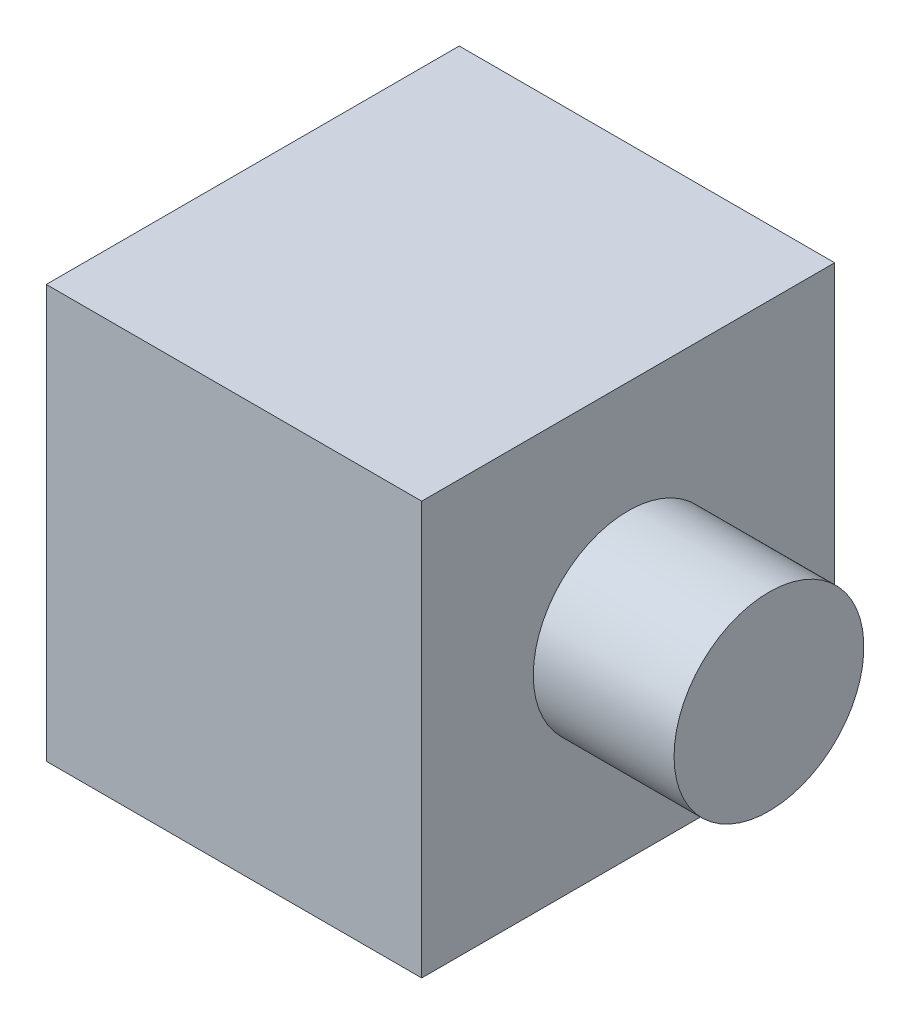
ISO-10303-21;
HEADER;
FILE_DESCRIPTION(('STEP AP214'),'2;1');
FILE_NAME('part.step','',(''),(''),'','','');
FILE_SCHEMA(('AUTOMOTIVE_DESIGN { 1 0 10303 214 1 1 1 1 }'));
ENDSEC;
DATA;
#1=APPLICATION_CONTEXT('core data for automotive mechanical design processes');
#2=APPLICATION_PROTOCOL_DEFINITION('international standard','automotive_design',2000,#1);
#3=PRODUCT_CONTEXT('',#1,'mechanical');
#4=PRODUCT('Part','Part','',(#3));
#5=PRODUCT_RELATED_PRODUCT_CATEGORY('part','',(#4));
#6=PRODUCT_DEFINITION_FORMATION('','',#4);
#7=PRODUCT_DEFINITION_CONTEXT('part definition',#1,'design');
#8=PRODUCT_DEFINITION('design','',#6,#7);
#9=PRODUCT_DEFINITION_SHAPE('','',#8);
#10=(LENGTH_UNIT() NAMED_UNIT(*) SI_UNIT(.MILLI.,.METRE.));
#11=(NAMED_UNIT(*) PLANE_ANGLE_UNIT() SI_UNIT($,.RADIAN.));
#12=(NAMED_UNIT(*) SI_UNIT($,.STERADIAN.) SOLID_ANGLE_UNIT());
#13=UNCERTAINTY_MEASURE_WITH_UNIT(LENGTH_MEASURE(1.E-05),#10,'distance_accuracy_value','');
#14=(GEOMETRIC_REPRESENTATION_CONTEXT(3) GLOBAL_UNCERTAINTY_ASSIGNED_CONTEXT((#13)) GLOBAL_UNIT_ASSIGNED_CONTEXT((#10,
#11,#12)) REPRESENTATION_CONTEXT('',''));
#15=CARTESIAN_POINT('',(0.,0.,0.));
#16=DIRECTION('',(0.,0.,1.));
#17=DIRECTION('',(1.,0.,0.));
#18=AXIS2_PLACEMENT_3D('',#15,#16,#17);
#19=CARTESIAN_POINT('',(-40.,22.,22.));
#20=DIRECTION('',(1.,0.,0.));
#21=DIRECTION('',(0.,0.,-1.));
#22=AXIS2_PLACEMENT_3D('',#19,#20,#21);
#23=PLANE('',#22);
#24=CARTESIAN_POINT('',(-40.,0.,0.));
#25=DIRECTION('',(1.,0.,0.));
#26=DIRECTION('',(0.,0.,-1.));
#27=AXIS2_PLACEMENT_3D('',#24,#25,#26);
#28=CIRCLE('',#27,7.2);
#29=CARTESIAN_POINT('',(-40.,0.,-7.2));
#30=VERTEX_POINT('',#29);
#31=EDGE_CURVE('E113',#30,#30,#28,.F.);
#32=ORIENTED_EDGE('',*,*,#31,.F.);
#33=EDGE_LOOP('',(#32));
#34=FACE_BOUND('',#33,.T.);
#35=DIRECTION('',(0.,-1.,0.));
#36=VECTOR('',#35,1.);
#37=CARTESIAN_POINT('',(-40.,22.,-22.));
#38=LINE('',#37,#36);
#39=CARTESIAN_POINT('',(-40.,22.,-22.));
#40=VERTEX_POINT('',#39);
#41=CARTESIAN_POINT('',(-40.,-22.,-22.));
#42=VERTEX_POINT('',#41);
#43=EDGE_CURVE('E110',#40,#42,#38,.T.);
#44=ORIENTED_EDGE('',*,*,#43,.T.);
#45=DIRECTION('',(0.,0.,-1.));
#46=VECTOR('',#45,1.);
#47=CARTESIAN_POINT('',(-40.,-22.,22.));
#48=LINE('',#47,#46);
#49=CARTESIAN_POINT('',(-40.,-22.,22.));
#50=VERTEX_POINT('',#49);
#51=EDGE_CURVE('E11',#50,#42,#48,.T.);
#52=ORIENTED_EDGE('',*,*,#51,.F.);
#53=DIRECTION('',(0.,-1.,0.));
#54=VECTOR('',#53,1.);
#55=CARTESIAN_POINT('',(-40.,22.,22.));
#56=LINE('',#55,#54);
#57=CARTESIAN_POINT('',(-40.,22.,22.));
#58=VERTEX_POINT('',#57);
#59=EDGE_CURVE('E94',#58,#50,#56,.T.);
#60=ORIENTED_EDGE('',*,*,#59,.F.);
#61=DIRECTION('',(0.,0.,-1.));
#62=VECTOR('',#61,1.);
#63=CARTESIAN_POINT('',(-40.,22.,22.));
#64=LINE('',#63,#62);
#65=EDGE_CURVE('E103',#58,#40,#64,.T.);
#66=ORIENTED_EDGE('',*,*,#65,.T.);
#67=EDGE_LOOP('',(#44,#52,#60,#66));
#68=FACE_BOUND('',#67,.T.);
#69=ADVANCED_FACE('F41',(#34,#68),#23,.F.);
#70=CARTESIAN_POINT('',(-40.,-22.,22.));
#71=DIRECTION('',(0.,1.,0.));
#72=DIRECTION('',(0.,0.,1.));
#73=AXIS2_PLACEMENT_3D('',#70,#71,#72);
#74=PLANE('',#73);
#75=CARTESIAN_POINT('',(-20.,-22.,0.));
#76=DIRECTION('',(0.,1.,0.));
#77=DIRECTION('',(0.,0.,1.));
#78=AXIS2_PLACEMENT_3D('',#75,#76,#77);
#79=CIRCLE('',#78,5.5);
#80=CARTESIAN_POINT('',(-20.,-22.,5.5));
#81=VERTEX_POINT('',#80);
#82=EDGE_CURVE('E42',#81,#81,#79,.T.);
#83=ORIENTED_EDGE('',*,*,#82,.T.);
#84=EDGE_LOOP('',(#83));
#85=FACE_BOUND('',#84,.T.);
#86=DIRECTION('',(1.,0.,0.));
#87=VECTOR('',#86,1.);
#88=CARTESIAN_POINT('',(-40.,-22.,-22.));
#89=LINE('',#88,#87);
#90=CARTESIAN_POINT('',(0.,-22.,-22.));
#91=VERTEX_POINT('',#90);
#92=EDGE_CURVE('E98',#42,#91,#89,.T.);
#93=ORIENTED_EDGE('',*,*,#92,.T.);
#94=DIRECTION('',(0.,0.,-1.));
#95=VECTOR('',#94,1.);
#96=CARTESIAN_POINT('',(0.,-22.,22.));
#97=LINE('',#96,#95);
#98=CARTESIAN_POINT('',(0.,-22.,22.));
#99=VERTEX_POINT('',#98);
#100=EDGE_CURVE('E49',#99,#91,#97,.T.);
#101=ORIENTED_EDGE('',*,*,#100,.F.);
#102=DIRECTION('',(1.,0.,0.));
#103=VECTOR('',#102,1.);
#104=CARTESIAN_POINT('',(-40.,-22.,22.));
#105=LINE('',#104,#103);
#106=EDGE_CURVE('E90',#50,#99,#105,.T.);
#107=ORIENTED_EDGE('',*,*,#106,.F.);
#108=ORIENTED_EDGE('',*,*,#51,.T.);
#109=EDGE_LOOP('',(#93,#101,#107,#108));
#110=FACE_BOUND('',#109,.T.);
#111=ADVANCED_FACE('F100',(#85,#110),#74,.F.);
#112=CARTESIAN_POINT('',(0.,-22.,22.));
#113=DIRECTION('',(-1.,0.,0.));
#114=DIRECTION('',(0.,0.,1.));
#115=AXIS2_PLACEMENT_3D('',#112,#113,#114);
#116=PLANE('',#115);
#117=CARTESIAN_POINT('',(0.,0.,0.));
#118=DIRECTION('',(-1.,0.,0.));
#119=DIRECTION('',(0.,0.,1.));
#120=AXIS2_PLACEMENT_3D('',#117,#118,#119);
#121=CIRCLE('',#120,10.1125);
#122=CARTESIAN_POINT('',(0.,0.,10.1125));
#123=VERTEX_POINT('',#122);
#124=EDGE_CURVE('E119',#123,#123,#121,.T.);
#125=ORIENTED_EDGE('',*,*,#124,.T.);
#126=EDGE_LOOP('',(#125));
#127=FACE_BOUND('',#126,.T.);
#128=DIRECTION('',(0.,1.,0.));
#129=VECTOR('',#128,1.);
#130=CARTESIAN_POINT('',(0.,-22.,-22.));
#131=LINE('',#130,#129);
#132=CARTESIAN_POINT('',(0.,22.,-22.));
#133=VERTEX_POINT('',#132);
#134=EDGE_CURVE('E77',#91,#133,#131,.T.);
#135=ORIENTED_EDGE('',*,*,#134,.T.);
#136=DIRECTION('',(0.,0.,-1.));
#137=VECTOR('',#136,1.);
#138=CARTESIAN_POINT('',(0.,22.,22.));
#139=LINE('',#138,#137);
#140=CARTESIAN_POINT('',(0.,22.,22.));
#141=VERTEX_POINT('',#140);
#142=EDGE_CURVE('E97',#141,#133,#139,.T.);
#143=ORIENTED_EDGE('',*,*,#142,.F.);
#144=DIRECTION('',(0.,1.,0.));
#145=VECTOR('',#144,1.);
#146=CARTESIAN_POINT('',(0.,-22.,22.));
#147=LINE('',#146,#145);
#148=EDGE_CURVE('E95',#99,#141,#147,.T.);
#149=ORIENTED_EDGE('',*,*,#148,.F.);
#150=ORIENTED_EDGE('',*,*,#100,.T.);
#151=EDGE_LOOP('',(#135,#143,#149,#150));
#152=FACE_BOUND('',#151,.T.);
#153=ADVANCED_FACE('F101',(#127,#152),#116,.F.);
#154=CARTESIAN_POINT('',(0.,22.,22.));
#155=DIRECTION('',(0.,-1.,0.));
#156=DIRECTION('',(0.,0.,-1.));
#157=AXIS2_PLACEMENT_3D('',#154,#155,#156);
#158=PLANE('',#157);
#159=DIRECTION('',(-1.,0.,0.));
#160=VECTOR('',#159,1.);
#161=CARTESIAN_POINT('',(0.,22.,-22.));
#162=LINE('',#161,#160);
#163=EDGE_CURVE('E84',#133,#40,#162,.T.);
#164=ORIENTED_EDGE('',*,*,#163,.T.);
#165=ORIENTED_EDGE('',*,*,#65,.F.);
#166=DIRECTION('',(-1.,0.,0.));
#167=VECTOR('',#166,1.);
#168=CARTESIAN_POINT('',(0.,22.,22.));
#169=LINE('',#168,#167);
#170=EDGE_CURVE('E56',#141,#58,#169,.T.);
#171=ORIENTED_EDGE('',*,*,#170,.F.);
#172=ORIENTED_EDGE('',*,*,#142,.T.);
#173=EDGE_LOOP('',(#164,#165,#171,#172));
#174=FACE_BOUND('',#173,.T.);
#175=ADVANCED_FACE('F159',(#174),#158,.F.);
#176=CARTESIAN_POINT('',(0.,0.,22.));
#177=DIRECTION('',(0.,0.,1.));
#178=DIRECTION('',(1.,0.,0.));
#179=AXIS2_PLACEMENT_3D('',#176,#177,#178);
#180=PLANE('',#179);
#181=ORIENTED_EDGE('',*,*,#59,.T.);
#182=ORIENTED_EDGE('',*,*,#106,.T.);
#183=ORIENTED_EDGE('',*,*,#148,.T.);
#184=ORIENTED_EDGE('',*,*,#170,.T.);
#185=EDGE_LOOP('',(#181,#182,#183,#184));
#186=FACE_BOUND('',#185,.T.);
#187=ADVANCED_FACE('F89',(#186),#180,.T.);
#188=CARTESIAN_POINT('',(0.,0.,-22.));
#189=DIRECTION('',(0.,0.,1.));
#190=DIRECTION('',(1.,0.,0.));
#191=AXIS2_PLACEMENT_3D('',#188,#189,#190);
#192=PLANE('',#191);
#193=ORIENTED_EDGE('',*,*,#43,.F.);
#194=ORIENTED_EDGE('',*,*,#163,.F.);
#195=ORIENTED_EDGE('',*,*,#134,.F.);
#196=ORIENTED_EDGE('',*,*,#92,.F.);
#197=EDGE_LOOP('',(#193,#194,#195,#196));
#198=FACE_BOUND('',#197,.T.);
#199=ADVANCED_FACE('F140',(#198),#192,.F.);
#200=CARTESIAN_POINT('',(15.,0.,0.));
#201=DIRECTION('',(-1.,0.,0.));
#202=DIRECTION('',(0.,0.,1.));
#203=AXIS2_PLACEMENT_3D('',#200,#201,#202);
#204=PLANE('',#203);
#205=CARTESIAN_POINT('',(14.9999999999999,0.,0.));
#206=DIRECTION('',(-1.,0.,0.));
#207=DIRECTION('',(0.,0.,1.));
#208=AXIS2_PLACEMENT_3D('',#205,#206,#207);
#209=CIRCLE('',#208,10.1125);
#210=CARTESIAN_POINT('',(14.9999999999999,0.,10.1125));
#211=VERTEX_POINT('',#210);
#212=EDGE_CURVE('E109',#211,#211,#209,.T.);
#213=ORIENTED_EDGE('',*,*,#212,.F.);
#214=EDGE_LOOP('',(#213));
#215=FACE_BOUND('',#214,.T.);
#216=ADVANCED_FACE('F137',(#215),#204,.F.);
#217=CARTESIAN_POINT('',(-1000.,0.,0.));
#218=DIRECTION('',(-1.,0.,0.));
#219=DIRECTION('',(0.,0.,1.));
#220=AXIS2_PLACEMENT_3D('',#217,#218,#219);
#221=CYLINDRICAL_SURFACE('',#220,10.1125);
#222=ORIENTED_EDGE('',*,*,#124,.F.);
#223=EDGE_LOOP('',(#222));
#224=FACE_BOUND('',#223,.T.);
#225=ORIENTED_EDGE('',*,*,#212,.T.);
#226=EDGE_LOOP('',(#225));
#227=FACE_BOUND('',#226,.T.);
#228=ADVANCED_FACE('F131',(#224,#227),#221,.T.);
#229=CARTESIAN_POINT('',(-1000.,0.,0.));
#230=DIRECTION('',(-1.,0.,0.));
#231=DIRECTION('',(0.,0.,1.));
#232=AXIS2_PLACEMENT_3D('',#229,#230,#231);
#233=CYLINDRICAL_SURFACE('',#232,7.2);
#234=CARTESIAN_POINT('',(-26.,0.,0.));
#235=DIRECTION('',(-1.,0.,0.));
#236=DIRECTION('',(0.,0.,1.));
#237=AXIS2_PLACEMENT_3D('',#234,#235,#236);
#238=CIRCLE('',#237,7.2);
#239=CARTESIAN_POINT('',(-26.,0.,7.2));
#240=VERTEX_POINT('',#239);
#241=EDGE_CURVE('E120',#240,#240,#238,.T.);
#242=ORIENTED_EDGE('',*,*,#241,.F.);
#243=EDGE_LOOP('',(#242));
#244=FACE_BOUND('',#243,.T.);
#245=ORIENTED_EDGE('',*,*,#31,.T.);
#246=EDGE_LOOP('',(#245));
#247=FACE_BOUND('',#246,.T.);
#248=ADVANCED_FACE('F145',(#244,#247),#233,.F.);
#249=CARTESIAN_POINT('',(-26.,0.,0.));
#250=DIRECTION('',(-1.,0.,0.));
#251=DIRECTION('',(0.,0.,1.));
#252=AXIS2_PLACEMENT_3D('',#249,#250,#251);
#253=PLANE('',#252);
#254=ORIENTED_EDGE('',*,*,#241,.T.);
#255=EDGE_LOOP('',(#254));
#256=FACE_BOUND('',#255,.T.);
#257=ADVANCED_FACE('F205',(#256),#253,.T.);
#258=CARTESIAN_POINT('',(-20.,-40.,0.));
#259=DIRECTION('',(0.,-1.,0.));
#260=DIRECTION('',(0.,0.,-1.));
#261=AXIS2_PLACEMENT_3D('',#258,#259,#260);
#262=CYLINDRICAL_SURFACE('',#261,5.5);
#263=CARTESIAN_POINT('',(-20.,-8.,0.));
#264=DIRECTION('',(0.,-1.,0.));
#265=DIRECTION('',(0.,0.,-1.));
#266=AXIS2_PLACEMENT_3D('',#263,#264,#265);
#267=CIRCLE('',#266,5.5);
#268=CARTESIAN_POINT('',(-20.,-8.,-5.5));
#269=VERTEX_POINT('',#268);
#270=EDGE_CURVE('E126',#269,#269,#267,.T.);
#271=ORIENTED_EDGE('',*,*,#270,.F.);
#272=EDGE_LOOP('',(#271));
#273=FACE_BOUND('',#272,.T.);
#274=ORIENTED_EDGE('',*,*,#82,.F.);
#275=EDGE_LOOP('',(#274));
#276=FACE_BOUND('',#275,.T.);
#277=ADVANCED_FACE('F202',(#273,#276),#262,.F.);
#278=CARTESIAN_POINT('',(-14.5,-8.,0.));
#279=DIRECTION('',(0.,1.,0.));
#280=DIRECTION('',(0.,0.,1.));
#281=AXIS2_PLACEMENT_3D('',#278,#279,#280);
#282=PLANE('',#281);
#283=ORIENTED_EDGE('',*,*,#270,.T.);
#284=EDGE_LOOP('',(#283));
#285=FACE_BOUND('',#284,.T.);
#286=ADVANCED_FACE('F207',(#285),#282,.F.);
#287=CLOSED_SHELL('',(#69,#111,#153,#175,#187,#199,#216,#228,#248,#257,#277,#286));
#288=MANIFOLD_SOLID_BREP('B2',#287);
#289=ADVANCED_BREP_SHAPE_REPRESENTATION('',(#18,#288),#14);
#290=SHAPE_DEFINITION_REPRESENTATION(#9,#289);
ENDSEC;
END-ISO-10303-21;
